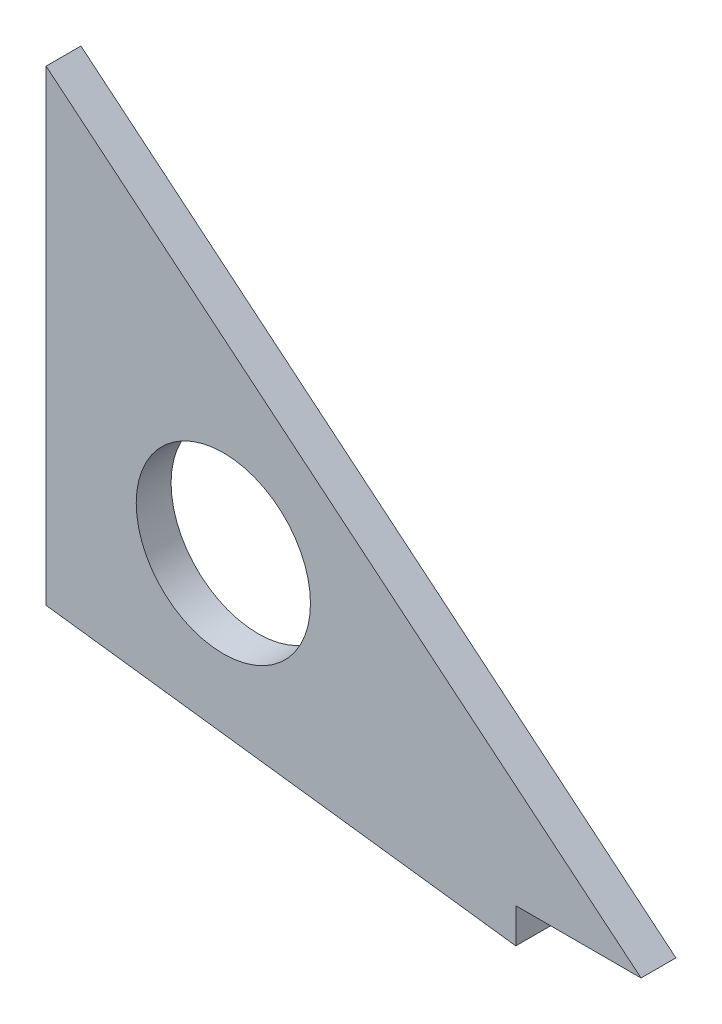
ISO-10303-21;
HEADER;
FILE_DESCRIPTION(('STEP AP214'),'2;1');
FILE_NAME('part.step','',(''),(''),'','','');
FILE_SCHEMA(('AUTOMOTIVE_DESIGN { 1 0 10303 214 1 1 1 1 }'));
ENDSEC;
DATA;
#1=APPLICATION_CONTEXT('core data for automotive mechanical design processes');
#2=APPLICATION_PROTOCOL_DEFINITION('international standard','automotive_design',2000,#1);
#3=PRODUCT_CONTEXT('',#1,'mechanical');
#4=PRODUCT('Part','Part','',(#3));
#5=PRODUCT_RELATED_PRODUCT_CATEGORY('part','',(#4));
#6=PRODUCT_DEFINITION_FORMATION('','',#4);
#7=PRODUCT_DEFINITION_CONTEXT('part definition',#1,'design');
#8=PRODUCT_DEFINITION('design','',#6,#7);
#9=PRODUCT_DEFINITION_SHAPE('','',#8);
#10=(LENGTH_UNIT() NAMED_UNIT(*) SI_UNIT(.MILLI.,.METRE.));
#11=(NAMED_UNIT(*) PLANE_ANGLE_UNIT() SI_UNIT($,.RADIAN.));
#12=(NAMED_UNIT(*) SI_UNIT($,.STERADIAN.) SOLID_ANGLE_UNIT());
#13=UNCERTAINTY_MEASURE_WITH_UNIT(LENGTH_MEASURE(1.E-05),#10,'distance_accuracy_value','');
#14=(GEOMETRIC_REPRESENTATION_CONTEXT(3) GLOBAL_UNCERTAINTY_ASSIGNED_CONTEXT((#13)) GLOBAL_UNIT_ASSIGNED_CONTEXT((#10,
#11,#12)) REPRESENTATION_CONTEXT('',''));
#15=CARTESIAN_POINT('',(0.,0.,0.));
#16=DIRECTION('',(0.,0.,1.));
#17=DIRECTION('',(1.,0.,0.));
#18=AXIS2_PLACEMENT_3D('',#15,#16,#17);
#19=CARTESIAN_POINT('',(0.,0.,2.));
#20=DIRECTION('',(0.,0.,1.));
#21=DIRECTION('',(1.,0.,0.));
#22=AXIS2_PLACEMENT_3D('',#19,#20,#21);
#23=PLANE('',#22);
#24=DIRECTION('',(0.99191787367075,-0.126881566401498,0.));
#25=VECTOR('',#24,1.);
#26=CARTESIAN_POINT('',(24.8749000033242,9.64544765087368,2.));
#27=LINE('',#26,#25);
#28=CARTESIAN_POINT('',(24.8749000033242,9.64544765087368,2.));
#29=VERTEX_POINT('',#28);
#30=CARTESIAN_POINT('',(51.832931887677,6.19710035985231,2.));
#31=VERTEX_POINT('',#30);
#32=EDGE_CURVE('E117',#29,#31,#27,.T.);
#33=ORIENTED_EDGE('',*,*,#32,.T.);
#34=DIRECTION('',(0.,1.,0.));
#35=VECTOR('',#34,1.);
#36=CARTESIAN_POINT('',(51.832931887677,6.19710035985231,2.));
#37=LINE('',#36,#35);
#38=CARTESIAN_POINT('',(51.832931887677,8.19710035985242,2.));
#39=VERTEX_POINT('',#38);
#40=EDGE_CURVE('E84',#31,#39,#37,.T.);
#41=ORIENTED_EDGE('',*,*,#40,.T.);
#42=DIRECTION('',(1.,0.,0.));
#43=VECTOR('',#42,1.);
#44=CARTESIAN_POINT('',(51.832931887677,8.19710035985242,2.));
#45=LINE('',#44,#43);
#46=CARTESIAN_POINT('',(59.0224318876765,8.19710035985242,2.));
#47=VERTEX_POINT('',#46);
#48=EDGE_CURVE('E88',#39,#47,#45,.T.);
#49=ORIENTED_EDGE('',*,*,#48,.T.);
#50=DIRECTION('',(-0.770489916442836,0.637452185391118,0.));
#51=VECTOR('',#50,1.);
#52=CARTESIAN_POINT('',(24.8749000033242,36.4485003598525,2.));
#53=LINE('',#52,#51);
#54=CARTESIAN_POINT('',(24.8749000033242,36.4485003598525,2.));
#55=VERTEX_POINT('',#54);
#56=EDGE_CURVE('E92',#47,#55,#53,.T.);
#57=ORIENTED_EDGE('',*,*,#56,.T.);
#58=DIRECTION('',(0.,-1.,0.));
#59=VECTOR('',#58,1.);
#60=CARTESIAN_POINT('',(24.8749000033242,9.64544765087368,2.));
#61=LINE('',#60,#59);
#62=EDGE_CURVE('E50',#55,#29,#61,.T.);
#63=ORIENTED_EDGE('',*,*,#62,.T.);
#64=EDGE_LOOP('',(#33,#41,#49,#57,#63));
#65=FACE_BOUND('',#64,.T.);
#66=CARTESIAN_POINT('',(35.0477710475714,17.3204386461484,2.));
#67=DIRECTION('',(0.,0.,1.));
#68=DIRECTION('',(1.,0.,0.));
#69=AXIS2_PLACEMENT_3D('',#66,#67,#68);
#70=CIRCLE('',#69,5.);
#71=CARTESIAN_POINT('',(40.0477710475714,17.3204386461484,2.));
#72=VERTEX_POINT('',#71);
#73=EDGE_CURVE('E112',#72,#72,#70,.T.);
#74=ORIENTED_EDGE('',*,*,#73,.F.);
#75=EDGE_LOOP('',(#74));
#76=FACE_BOUND('',#75,.T.);
#77=ADVANCED_FACE('F33',(#65,#76),#23,.T.);
#78=CARTESIAN_POINT('',(0.,0.,0.));
#79=DIRECTION('',(0.,0.,1.));
#80=DIRECTION('',(1.,0.,0.));
#81=AXIS2_PLACEMENT_3D('',#78,#79,#80);
#82=PLANE('',#81);
#83=DIRECTION('',(0.99191787367075,-0.126881566401498,0.));
#84=VECTOR('',#83,1.);
#85=CARTESIAN_POINT('',(24.8749000033242,9.64544765087368,0.));
#86=LINE('',#85,#84);
#87=CARTESIAN_POINT('',(24.8749000033242,9.64544765087368,0.));
#88=VERTEX_POINT('',#87);
#89=CARTESIAN_POINT('',(51.832931887677,6.19710035985231,0.));
#90=VERTEX_POINT('',#89);
#91=EDGE_CURVE('E108',#88,#90,#86,.T.);
#92=ORIENTED_EDGE('',*,*,#91,.F.);
#93=DIRECTION('',(0.,-1.,0.));
#94=VECTOR('',#93,1.);
#95=CARTESIAN_POINT('',(24.8749000033242,9.64544765087368,0.));
#96=LINE('',#95,#94);
#97=CARTESIAN_POINT('',(24.8749000033242,36.4485003598525,0.));
#98=VERTEX_POINT('',#97);
#99=EDGE_CURVE('E76',#98,#88,#96,.T.);
#100=ORIENTED_EDGE('',*,*,#99,.F.);
#101=DIRECTION('',(-0.770489916442836,0.637452185391118,0.));
#102=VECTOR('',#101,1.);
#103=CARTESIAN_POINT('',(24.8749000033242,36.4485003598525,0.));
#104=LINE('',#103,#102);
#105=CARTESIAN_POINT('',(59.0224318876765,8.19710035985242,0.));
#106=VERTEX_POINT('',#105);
#107=EDGE_CURVE('E70',#106,#98,#104,.T.);
#108=ORIENTED_EDGE('',*,*,#107,.F.);
#109=DIRECTION('',(1.,0.,0.));
#110=VECTOR('',#109,1.);
#111=CARTESIAN_POINT('',(51.832931887677,8.19710035985242,0.));
#112=LINE('',#111,#110);
#113=CARTESIAN_POINT('',(51.832931887677,8.19710035985242,0.));
#114=VERTEX_POINT('',#113);
#115=EDGE_CURVE('E99',#114,#106,#112,.T.);
#116=ORIENTED_EDGE('',*,*,#115,.F.);
#117=DIRECTION('',(0.,1.,0.));
#118=VECTOR('',#117,1.);
#119=CARTESIAN_POINT('',(51.832931887677,6.19710035985231,0.));
#120=LINE('',#119,#118);
#121=EDGE_CURVE('E111',#90,#114,#120,.T.);
#122=ORIENTED_EDGE('',*,*,#121,.F.);
#123=EDGE_LOOP('',(#92,#100,#108,#116,#122));
#124=FACE_BOUND('',#123,.T.);
#125=CARTESIAN_POINT('',(35.0477710475714,17.3204386461484,0.));
#126=DIRECTION('',(0.,0.,1.));
#127=DIRECTION('',(1.,0.,0.));
#128=AXIS2_PLACEMENT_3D('',#125,#126,#127);
#129=CIRCLE('',#128,5.);
#130=CARTESIAN_POINT('',(40.0477710475714,17.3204386461484,0.));
#131=VERTEX_POINT('',#130);
#132=EDGE_CURVE('E197',#131,#131,#129,.T.);
#133=ORIENTED_EDGE('',*,*,#132,.T.);
#134=EDGE_LOOP('',(#133));
#135=FACE_BOUND('',#134,.T.);
#136=ADVANCED_FACE('F121',(#124,#135),#82,.F.);
#137=CARTESIAN_POINT('',(24.8749000033242,9.64544765087368,2.));
#138=DIRECTION('',(0.126881566401498,0.99191787367075,0.));
#139=DIRECTION('',(-0.99191787367075,0.126881566401498,0.));
#140=AXIS2_PLACEMENT_3D('',#137,#138,#139);
#141=PLANE('',#140);
#142=ORIENTED_EDGE('',*,*,#91,.T.);
#143=DIRECTION('',(0.,0.,-1.));
#144=VECTOR('',#143,1.);
#145=CARTESIAN_POINT('',(51.832931887677,6.19710035985231,2.));
#146=LINE('',#145,#144);
#147=EDGE_CURVE('E11',#31,#90,#146,.T.);
#148=ORIENTED_EDGE('',*,*,#147,.F.);
#149=ORIENTED_EDGE('',*,*,#32,.F.);
#150=DIRECTION('',(0.,0.,-1.));
#151=VECTOR('',#150,1.);
#152=CARTESIAN_POINT('',(24.8749000033242,9.64544765087368,2.));
#153=LINE('',#152,#151);
#154=EDGE_CURVE('E104',#29,#88,#153,.T.);
#155=ORIENTED_EDGE('',*,*,#154,.T.);
#156=EDGE_LOOP('',(#142,#148,#149,#155));
#157=FACE_BOUND('',#156,.T.);
#158=ADVANCED_FACE('F35',(#157),#141,.F.);
#159=CARTESIAN_POINT('',(51.832931887677,6.19710035985231,2.));
#160=DIRECTION('',(-1.,0.,0.));
#161=DIRECTION('',(0.,0.,1.));
#162=AXIS2_PLACEMENT_3D('',#159,#160,#161);
#163=PLANE('',#162);
#164=ORIENTED_EDGE('',*,*,#121,.T.);
#165=DIRECTION('',(0.,0.,-1.));
#166=VECTOR('',#165,1.);
#167=CARTESIAN_POINT('',(51.832931887677,8.19710035985242,2.));
#168=LINE('',#167,#166);
#169=EDGE_CURVE('E42',#39,#114,#168,.T.);
#170=ORIENTED_EDGE('',*,*,#169,.F.);
#171=ORIENTED_EDGE('',*,*,#40,.F.);
#172=ORIENTED_EDGE('',*,*,#147,.T.);
#173=EDGE_LOOP('',(#164,#170,#171,#172));
#174=FACE_BOUND('',#173,.T.);
#175=ADVANCED_FACE('F146',(#174),#163,.F.);
#176=CARTESIAN_POINT('',(51.832931887677,8.19710035985242,2.));
#177=DIRECTION('',(0.,1.,0.));
#178=DIRECTION('',(0.,0.,1.));
#179=AXIS2_PLACEMENT_3D('',#176,#177,#178);
#180=PLANE('',#179);
#181=ORIENTED_EDGE('',*,*,#115,.T.);
#182=DIRECTION('',(0.,0.,-1.));
#183=VECTOR('',#182,1.);
#184=CARTESIAN_POINT('',(59.0224318876765,8.19710035985242,2.));
#185=LINE('',#184,#183);
#186=EDGE_CURVE('E96',#47,#106,#185,.T.);
#187=ORIENTED_EDGE('',*,*,#186,.F.);
#188=ORIENTED_EDGE('',*,*,#48,.F.);
#189=ORIENTED_EDGE('',*,*,#169,.T.);
#190=EDGE_LOOP('',(#181,#187,#188,#189));
#191=FACE_BOUND('',#190,.T.);
#192=ADVANCED_FACE('F97',(#191),#180,.F.);
#193=CARTESIAN_POINT('',(24.8749000033242,36.4485003598525,2.));
#194=DIRECTION('',(-0.637452185391118,-0.770489916442836,0.));
#195=DIRECTION('',(0.770489916442836,-0.637452185391118,0.));
#196=AXIS2_PLACEMENT_3D('',#193,#194,#195);
#197=PLANE('',#196);
#198=ORIENTED_EDGE('',*,*,#107,.T.);
#199=DIRECTION('',(0.,0.,-1.));
#200=VECTOR('',#199,1.);
#201=CARTESIAN_POINT('',(24.8749000033242,36.4485003598525,2.));
#202=LINE('',#201,#200);
#203=EDGE_CURVE('E100',#55,#98,#202,.T.);
#204=ORIENTED_EDGE('',*,*,#203,.F.);
#205=ORIENTED_EDGE('',*,*,#56,.F.);
#206=ORIENTED_EDGE('',*,*,#186,.T.);
#207=EDGE_LOOP('',(#198,#204,#205,#206));
#208=FACE_BOUND('',#207,.T.);
#209=ADVANCED_FACE('F102',(#208),#197,.F.);
#210=CARTESIAN_POINT('',(24.8749000033242,9.64544765087368,2.));
#211=DIRECTION('',(1.,0.,0.));
#212=DIRECTION('',(0.,0.,-1.));
#213=AXIS2_PLACEMENT_3D('',#210,#211,#212);
#214=PLANE('',#213);
#215=ORIENTED_EDGE('',*,*,#99,.T.);
#216=ORIENTED_EDGE('',*,*,#154,.F.);
#217=ORIENTED_EDGE('',*,*,#62,.F.);
#218=ORIENTED_EDGE('',*,*,#203,.T.);
#219=EDGE_LOOP('',(#215,#216,#217,#218));
#220=FACE_BOUND('',#219,.T.);
#221=ADVANCED_FACE('F126',(#220),#214,.F.);
#222=CARTESIAN_POINT('',(35.0477710475714,17.3204386461484,2.));
#223=DIRECTION('',(0.,0.,-1.));
#224=DIRECTION('',(-1.,0.,0.));
#225=AXIS2_PLACEMENT_3D('',#222,#223,#224);
#226=CYLINDRICAL_SURFACE('',#225,5.);
#227=ORIENTED_EDGE('',*,*,#73,.T.);
#228=EDGE_LOOP('',(#227));
#229=FACE_BOUND('',#228,.T.);
#230=ORIENTED_EDGE('',*,*,#132,.F.);
#231=EDGE_LOOP('',(#230));
#232=FACE_BOUND('',#231,.T.);
#233=ADVANCED_FACE('F128',(#229,#232),#226,.F.);
#234=CLOSED_SHELL('',(#77,#136,#158,#175,#192,#209,#221,#233));
#235=MANIFOLD_SOLID_BREP('B2',#234);
#236=ADVANCED_BREP_SHAPE_REPRESENTATION('',(#18,#235),#14);
#237=SHAPE_DEFINITION_REPRESENTATION(#9,#236);
ENDSEC;
END-ISO-10303-21;
